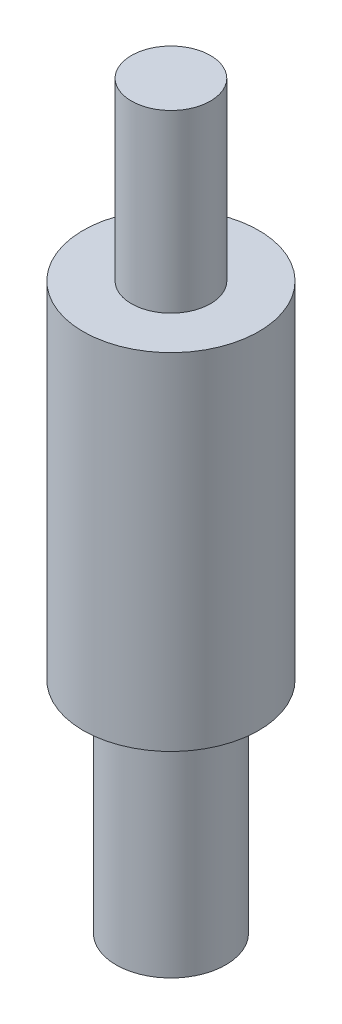
ISO-10303-21;
HEADER;
FILE_DESCRIPTION(('STEP AP214'),'2;1');
FILE_NAME('part.step','',(''),(''),'','','');
FILE_SCHEMA(('AUTOMOTIVE_DESIGN { 1 0 10303 214 1 1 1 1 }'));
ENDSEC;
DATA;
#1=APPLICATION_CONTEXT('core data for automotive mechanical design processes');
#2=APPLICATION_PROTOCOL_DEFINITION('international standard','automotive_design',2000,#1);
#3=PRODUCT_CONTEXT('',#1,'mechanical');
#4=PRODUCT('Part','Part','',(#3));
#5=PRODUCT_RELATED_PRODUCT_CATEGORY('part','',(#4));
#6=PRODUCT_DEFINITION_FORMATION('','',#4);
#7=PRODUCT_DEFINITION_CONTEXT('part definition',#1,'design');
#8=PRODUCT_DEFINITION('design','',#6,#7);
#9=PRODUCT_DEFINITION_SHAPE('','',#8);
#10=(LENGTH_UNIT() NAMED_UNIT(*) SI_UNIT(.MILLI.,.METRE.));
#11=(NAMED_UNIT(*) PLANE_ANGLE_UNIT() SI_UNIT($,.RADIAN.));
#12=(NAMED_UNIT(*) SI_UNIT($,.STERADIAN.) SOLID_ANGLE_UNIT());
#13=UNCERTAINTY_MEASURE_WITH_UNIT(LENGTH_MEASURE(1.E-05),#10,'distance_accuracy_value','');
#14=(GEOMETRIC_REPRESENTATION_CONTEXT(3) GLOBAL_UNCERTAINTY_ASSIGNED_CONTEXT((#13)) GLOBAL_UNIT_ASSIGNED_CONTEXT((#10,
#11,#12)) REPRESENTATION_CONTEXT('',''));
#15=CARTESIAN_POINT('',(0.,0.,0.));
#16=DIRECTION('',(0.,0.,1.));
#17=DIRECTION('',(1.,0.,0.));
#18=AXIS2_PLACEMENT_3D('',#15,#16,#17);
#19=CARTESIAN_POINT('',(0.,5.,0.));
#20=DIRECTION('',(0.,-1.,0.));
#21=DIRECTION('',(0.,0.,-1.));
#22=AXIS2_PLACEMENT_3D('',#19,#20,#21);
#23=CYLINDRICAL_SURFACE('',#22,1.25);
#24=CARTESIAN_POINT('',(0.,5.,0.));
#25=DIRECTION('',(0.,1.,0.));
#26=DIRECTION('',(0.,0.,1.));
#27=AXIS2_PLACEMENT_3D('',#24,#25,#26);
#28=CIRCLE('',#27,1.25);
#29=CARTESIAN_POINT('',(0.,5.,1.25));
#30=VERTEX_POINT('',#29);
#31=EDGE_CURVE('E44',#30,#30,#28,.T.);
#32=ORIENTED_EDGE('',*,*,#31,.F.);
#33=EDGE_LOOP('',(#32));
#34=FACE_BOUND('',#33,.T.);
#35=CARTESIAN_POINT('',(0.,0.,0.));
#36=DIRECTION('',(0.,1.,0.));
#37=DIRECTION('',(0.,0.,1.));
#38=AXIS2_PLACEMENT_3D('',#35,#36,#37);
#39=CIRCLE('',#38,1.25);
#40=CARTESIAN_POINT('',(0.,0.,1.25));
#41=VERTEX_POINT('',#40);
#42=EDGE_CURVE('E40',#41,#41,#39,.T.);
#43=ORIENTED_EDGE('',*,*,#42,.T.);
#44=EDGE_LOOP('',(#43));
#45=FACE_BOUND('',#44,.T.);
#46=ADVANCED_FACE('F37',(#34,#45),#23,.T.);
#47=CARTESIAN_POINT('',(0.,0.,0.));
#48=DIRECTION('',(0.,1.,0.));
#49=DIRECTION('',(0.,0.,1.));
#50=AXIS2_PLACEMENT_3D('',#47,#48,#49);
#51=PLANE('',#50);
#52=ORIENTED_EDGE('',*,*,#42,.F.);
#53=EDGE_LOOP('',(#52));
#54=FACE_BOUND('',#53,.T.);
#55=ADVANCED_FACE('F79',(#54),#51,.F.);
#56=CARTESIAN_POINT('',(0.,12.87,0.));
#57=DIRECTION('',(0.,-1.,0.));
#58=DIRECTION('',(0.,0.,-1.));
#59=AXIS2_PLACEMENT_3D('',#56,#57,#58);
#60=CYLINDRICAL_SURFACE('',#59,2.);
#61=CARTESIAN_POINT('',(0.,12.87,0.));
#62=DIRECTION('',(0.,1.,0.));
#63=DIRECTION('',(0.,0.,1.));
#64=AXIS2_PLACEMENT_3D('',#61,#62,#63);
#65=CIRCLE('',#64,2.);
#66=CARTESIAN_POINT('',(0.,12.87,2.));
#67=VERTEX_POINT('',#66);
#68=EDGE_CURVE('E52',#67,#67,#65,.T.);
#69=ORIENTED_EDGE('',*,*,#68,.F.);
#70=EDGE_LOOP('',(#69));
#71=FACE_BOUND('',#70,.T.);
#72=CARTESIAN_POINT('',(0.,5.,0.));
#73=DIRECTION('',(0.,1.,0.));
#74=DIRECTION('',(0.,0.,1.));
#75=AXIS2_PLACEMENT_3D('',#72,#73,#74);
#76=CIRCLE('',#75,2.);
#77=CARTESIAN_POINT('',(0.,5.,2.));
#78=VERTEX_POINT('',#77);
#79=EDGE_CURVE('E55',#78,#78,#76,.T.);
#80=ORIENTED_EDGE('',*,*,#79,.T.);
#81=EDGE_LOOP('',(#80));
#82=FACE_BOUND('',#81,.T.);
#83=ADVANCED_FACE('F84',(#71,#82),#60,.T.);
#84=CARTESIAN_POINT('',(0.,12.87,0.));
#85=DIRECTION('',(0.,1.,0.));
#86=DIRECTION('',(0.,0.,1.));
#87=AXIS2_PLACEMENT_3D('',#84,#85,#86);
#88=PLANE('',#87);
#89=CARTESIAN_POINT('',(0.,12.87,0.));
#90=DIRECTION('',(0.,1.,0.));
#91=DIRECTION('',(0.,0.,1.));
#92=AXIS2_PLACEMENT_3D('',#89,#90,#91);
#93=CIRCLE('',#92,0.9);
#94=CARTESIAN_POINT('',(0.,12.87,0.9));
#95=VERTEX_POINT('',#94);
#96=EDGE_CURVE('E10',#95,#95,#93,.T.);
#97=ORIENTED_EDGE('',*,*,#96,.F.);
#98=EDGE_LOOP('',(#97));
#99=FACE_BOUND('',#98,.T.);
#100=ORIENTED_EDGE('',*,*,#68,.T.);
#101=EDGE_LOOP('',(#100));
#102=FACE_BOUND('',#101,.T.);
#103=ADVANCED_FACE('F74',(#99,#102),#88,.T.);
#104=CARTESIAN_POINT('',(0.,5.,0.));
#105=DIRECTION('',(0.,1.,0.));
#106=DIRECTION('',(0.,0.,1.));
#107=AXIS2_PLACEMENT_3D('',#104,#105,#106);
#108=PLANE('',#107);
#109=ORIENTED_EDGE('',*,*,#31,.T.);
#110=EDGE_LOOP('',(#109));
#111=FACE_BOUND('',#110,.T.);
#112=ORIENTED_EDGE('',*,*,#79,.F.);
#113=EDGE_LOOP('',(#112));
#114=FACE_BOUND('',#113,.T.);
#115=ADVANCED_FACE('F66',(#111,#114),#108,.F.);
#116=CARTESIAN_POINT('',(0.,16.87,0.));
#117=DIRECTION('',(0.,-1.,0.));
#118=DIRECTION('',(0.,0.,-1.));
#119=AXIS2_PLACEMENT_3D('',#116,#117,#118);
#120=CYLINDRICAL_SURFACE('',#119,0.9);
#121=CARTESIAN_POINT('',(0.,16.87,0.));
#122=DIRECTION('',(0.,1.,0.));
#123=DIRECTION('',(0.,0.,1.));
#124=AXIS2_PLACEMENT_3D('',#121,#122,#123);
#125=CIRCLE('',#124,0.9);
#126=CARTESIAN_POINT('',(0.,16.87,0.9));
#127=VERTEX_POINT('',#126);
#128=EDGE_CURVE('E51',#127,#127,#125,.T.);
#129=ORIENTED_EDGE('',*,*,#128,.F.);
#130=EDGE_LOOP('',(#129));
#131=FACE_BOUND('',#130,.T.);
#132=ORIENTED_EDGE('',*,*,#96,.T.);
#133=EDGE_LOOP('',(#132));
#134=FACE_BOUND('',#133,.T.);
#135=ADVANCED_FACE('F64',(#131,#134),#120,.T.);
#136=CARTESIAN_POINT('',(0.,16.87,0.));
#137=DIRECTION('',(0.,1.,0.));
#138=DIRECTION('',(0.,0.,1.));
#139=AXIS2_PLACEMENT_3D('',#136,#137,#138);
#140=PLANE('',#139);
#141=ORIENTED_EDGE('',*,*,#128,.T.);
#142=EDGE_LOOP('',(#141));
#143=FACE_BOUND('',#142,.T.);
#144=ADVANCED_FACE('F62',(#143),#140,.T.);
#145=CLOSED_SHELL('',(#46,#55,#83,#103,#115,#135,#144));
#146=MANIFOLD_SOLID_BREP('B2',#145);
#147=ADVANCED_BREP_SHAPE_REPRESENTATION('',(#18,#146),#14);
#148=SHAPE_DEFINITION_REPRESENTATION(#9,#147);
ENDSEC;
END-ISO-10303-21;
